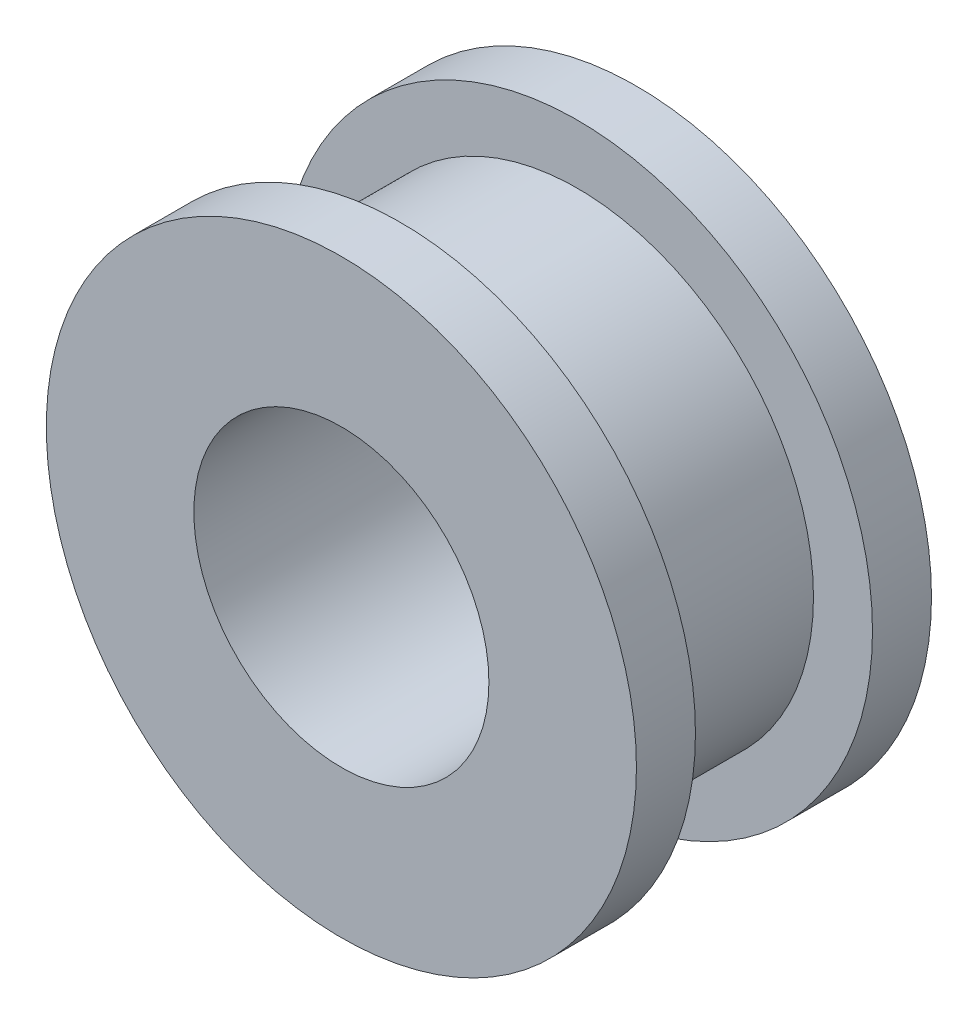
ISO-10303-21;
HEADER;
FILE_DESCRIPTION(('STEP AP214'),'2;1');
FILE_NAME('part.step','',(''),(''),'','','');
FILE_SCHEMA(('AUTOMOTIVE_DESIGN { 1 0 10303 214 1 1 1 1 }'));
ENDSEC;
DATA;
#1=APPLICATION_CONTEXT('core data for automotive mechanical design processes');
#2=APPLICATION_PROTOCOL_DEFINITION('international standard','automotive_design',2000,#1);
#3=PRODUCT_CONTEXT('',#1,'mechanical');
#4=PRODUCT('Part','Part','',(#3));
#5=PRODUCT_RELATED_PRODUCT_CATEGORY('part','',(#4));
#6=PRODUCT_DEFINITION_FORMATION('','',#4);
#7=PRODUCT_DEFINITION_CONTEXT('part definition',#1,'design');
#8=PRODUCT_DEFINITION('design','',#6,#7);
#9=PRODUCT_DEFINITION_SHAPE('','',#8);
#10=(LENGTH_UNIT() NAMED_UNIT(*) SI_UNIT(.MILLI.,.METRE.));
#11=(NAMED_UNIT(*) PLANE_ANGLE_UNIT() SI_UNIT($,.RADIAN.));
#12=(NAMED_UNIT(*) SI_UNIT($,.STERADIAN.) SOLID_ANGLE_UNIT());
#13=UNCERTAINTY_MEASURE_WITH_UNIT(LENGTH_MEASURE(1.E-05),#10,'distance_accuracy_value','');
#14=(GEOMETRIC_REPRESENTATION_CONTEXT(3) GLOBAL_UNCERTAINTY_ASSIGNED_CONTEXT((#13)) GLOBAL_UNIT_ASSIGNED_CONTEXT((#10,
#11,#12)) REPRESENTATION_CONTEXT('',''));
#15=CARTESIAN_POINT('',(0.,0.,0.));
#16=DIRECTION('',(0.,0.,1.));
#17=DIRECTION('',(1.,0.,0.));
#18=AXIS2_PLACEMENT_3D('',#15,#16,#17);
#19=CARTESIAN_POINT('',(0.,0.,5.));
#20=DIRECTION('',(0.,0.,-1.));
#21=DIRECTION('',(-1.,0.,0.));
#22=AXIS2_PLACEMENT_3D('',#19,#20,#21);
#23=CYLINDRICAL_SURFACE('',#22,5.);
#24=CARTESIAN_POINT('',(0.,0.,0.));
#25=DIRECTION('',(0.,0.,1.));
#26=DIRECTION('',(1.,0.,0.));
#27=AXIS2_PLACEMENT_3D('',#24,#25,#26);
#28=CIRCLE('',#27,5.);
#29=CARTESIAN_POINT('',(5.,0.,0.));
#30=VERTEX_POINT('',#29);
#31=EDGE_CURVE('E35',#30,#30,#28,.T.);
#32=ORIENTED_EDGE('',*,*,#31,.T.);
#33=EDGE_LOOP('',(#32));
#34=FACE_BOUND('',#33,.T.);
#35=CARTESIAN_POINT('',(0.,0.,1.));
#36=DIRECTION('',(0.,0.,1.));
#37=DIRECTION('',(1.,0.,0.));
#38=AXIS2_PLACEMENT_3D('',#35,#36,#37);
#39=CIRCLE('',#38,5.);
#40=CARTESIAN_POINT('',(5.,0.,1.));
#41=VERTEX_POINT('',#40);
#42=EDGE_CURVE('E58',#41,#41,#39,.T.);
#43=ORIENTED_EDGE('',*,*,#42,.F.);
#44=EDGE_LOOP('',(#43));
#45=FACE_BOUND('',#44,.T.);
#46=ADVANCED_FACE('F31',(#34,#45),#23,.T.);
#47=CARTESIAN_POINT('',(0.,0.,5.));
#48=DIRECTION('',(0.,0.,-1.));
#49=DIRECTION('',(-1.,0.,0.));
#50=AXIS2_PLACEMENT_3D('',#47,#48,#49);
#51=CYLINDRICAL_SURFACE('',#50,2.5);
#52=CARTESIAN_POINT('',(0.,0.,5.));
#53=DIRECTION('',(0.,0.,1.));
#54=DIRECTION('',(1.,0.,0.));
#55=AXIS2_PLACEMENT_3D('',#52,#53,#54);
#56=CIRCLE('',#55,2.5);
#57=CARTESIAN_POINT('',(2.5,0.,5.));
#58=VERTEX_POINT('',#57);
#59=EDGE_CURVE('E39',#58,#58,#56,.T.);
#60=ORIENTED_EDGE('',*,*,#59,.T.);
#61=EDGE_LOOP('',(#60));
#62=FACE_BOUND('',#61,.T.);
#63=CARTESIAN_POINT('',(0.,0.,0.));
#64=DIRECTION('',(0.,0.,1.));
#65=DIRECTION('',(1.,0.,0.));
#66=AXIS2_PLACEMENT_3D('',#63,#64,#65);
#67=CIRCLE('',#66,2.5);
#68=CARTESIAN_POINT('',(2.5,0.,0.));
#69=VERTEX_POINT('',#68);
#70=EDGE_CURVE('E46',#69,#69,#67,.T.);
#71=ORIENTED_EDGE('',*,*,#70,.F.);
#72=EDGE_LOOP('',(#71));
#73=FACE_BOUND('',#72,.T.);
#74=ADVANCED_FACE('F33',(#62,#73),#51,.F.);
#75=CARTESIAN_POINT('',(0.,0.,4.));
#76=DIRECTION('',(0.,0.,1.));
#77=DIRECTION('',(1.,0.,0.));
#78=AXIS2_PLACEMENT_3D('',#75,#76,#77);
#79=CIRCLE('',#78,5.);
#80=CARTESIAN_POINT('',(5.,0.,4.));
#81=VERTEX_POINT('',#80);
#82=EDGE_CURVE('E48',#81,#81,#79,.T.);
#83=ORIENTED_EDGE('',*,*,#82,.T.);
#84=EDGE_LOOP('',(#83));
#85=FACE_BOUND('',#84,.T.);
#86=CARTESIAN_POINT('',(0.,0.,5.));
#87=DIRECTION('',(0.,0.,1.));
#88=DIRECTION('',(1.,0.,0.));
#89=AXIS2_PLACEMENT_3D('',#86,#87,#88);
#90=CIRCLE('',#89,5.);
#91=CARTESIAN_POINT('',(5.,0.,5.));
#92=VERTEX_POINT('',#91);
#93=EDGE_CURVE('E10',#92,#92,#90,.T.);
#94=ORIENTED_EDGE('',*,*,#93,.F.);
#95=EDGE_LOOP('',(#94));
#96=FACE_BOUND('',#95,.T.);
#97=ADVANCED_FACE('F70',(#85,#96),#23,.T.);
#98=CARTESIAN_POINT('',(0.,0.,5.));
#99=DIRECTION('',(0.,0.,1.));
#100=DIRECTION('',(1.,0.,0.));
#101=AXIS2_PLACEMENT_3D('',#98,#99,#100);
#102=PLANE('',#101);
#103=ORIENTED_EDGE('',*,*,#59,.F.);
#104=EDGE_LOOP('',(#103));
#105=FACE_BOUND('',#104,.T.);
#106=ORIENTED_EDGE('',*,*,#93,.T.);
#107=EDGE_LOOP('',(#106));
#108=FACE_BOUND('',#107,.T.);
#109=ADVANCED_FACE('F77',(#105,#108),#102,.T.);
#110=CARTESIAN_POINT('',(0.,0.,0.));
#111=DIRECTION('',(0.,0.,1.));
#112=DIRECTION('',(1.,0.,0.));
#113=AXIS2_PLACEMENT_3D('',#110,#111,#112);
#114=PLANE('',#113);
#115=ORIENTED_EDGE('',*,*,#70,.T.);
#116=EDGE_LOOP('',(#115));
#117=FACE_BOUND('',#116,.T.);
#118=ORIENTED_EDGE('',*,*,#31,.F.);
#119=EDGE_LOOP('',(#118));
#120=FACE_BOUND('',#119,.T.);
#121=ADVANCED_FACE('F81',(#117,#120),#114,.F.);
#122=CARTESIAN_POINT('',(0.,0.,4.));
#123=DIRECTION('',(0.,0.,-1.));
#124=DIRECTION('',(-1.,0.,0.));
#125=AXIS2_PLACEMENT_3D('',#122,#123,#124);
#126=CYLINDRICAL_SURFACE('',#125,4.);
#127=CARTESIAN_POINT('',(0.,0.,4.));
#128=DIRECTION('',(0.,0.,1.));
#129=DIRECTION('',(1.,0.,0.));
#130=AXIS2_PLACEMENT_3D('',#127,#128,#129);
#131=CIRCLE('',#130,4.);
#132=CARTESIAN_POINT('',(4.,0.,4.));
#133=VERTEX_POINT('',#132);
#134=EDGE_CURVE('E53',#133,#133,#131,.T.);
#135=ORIENTED_EDGE('',*,*,#134,.F.);
#136=EDGE_LOOP('',(#135));
#137=FACE_BOUND('',#136,.T.);
#138=CARTESIAN_POINT('',(0.,0.,1.));
#139=DIRECTION('',(0.,0.,1.));
#140=DIRECTION('',(1.,0.,0.));
#141=AXIS2_PLACEMENT_3D('',#138,#139,#140);
#142=CIRCLE('',#141,4.);
#143=CARTESIAN_POINT('',(4.,0.,1.));
#144=VERTEX_POINT('',#143);
#145=EDGE_CURVE('E61',#144,#144,#142,.T.);
#146=ORIENTED_EDGE('',*,*,#145,.T.);
#147=EDGE_LOOP('',(#146));
#148=FACE_BOUND('',#147,.T.);
#149=ADVANCED_FACE('F88',(#137,#148),#126,.T.);
#150=CARTESIAN_POINT('',(0.,0.,4.));
#151=DIRECTION('',(0.,0.,1.));
#152=DIRECTION('',(1.,0.,0.));
#153=AXIS2_PLACEMENT_3D('',#150,#151,#152);
#154=PLANE('',#153);
#155=ORIENTED_EDGE('',*,*,#134,.T.);
#156=EDGE_LOOP('',(#155));
#157=FACE_BOUND('',#156,.T.);
#158=ORIENTED_EDGE('',*,*,#82,.F.);
#159=EDGE_LOOP('',(#158));
#160=FACE_BOUND('',#159,.T.);
#161=ADVANCED_FACE('F93',(#157,#160),#154,.F.);
#162=CARTESIAN_POINT('',(0.,0.,1.));
#163=DIRECTION('',(0.,0.,1.));
#164=DIRECTION('',(1.,0.,0.));
#165=AXIS2_PLACEMENT_3D('',#162,#163,#164);
#166=PLANE('',#165);
#167=ORIENTED_EDGE('',*,*,#145,.F.);
#168=EDGE_LOOP('',(#167));
#169=FACE_BOUND('',#168,.T.);
#170=ORIENTED_EDGE('',*,*,#42,.T.);
#171=EDGE_LOOP('',(#170));
#172=FACE_BOUND('',#171,.T.);
#173=ADVANCED_FACE('F66',(#169,#172),#166,.T.);
#174=CLOSED_SHELL('',(#46,#74,#97,#109,#121,#149,#161,#173));
#175=MANIFOLD_SOLID_BREP('B2',#174);
#176=ADVANCED_BREP_SHAPE_REPRESENTATION('',(#18,#175),#14);
#177=SHAPE_DEFINITION_REPRESENTATION(#9,#176);
ENDSEC;
END-ISO-10303-21;
